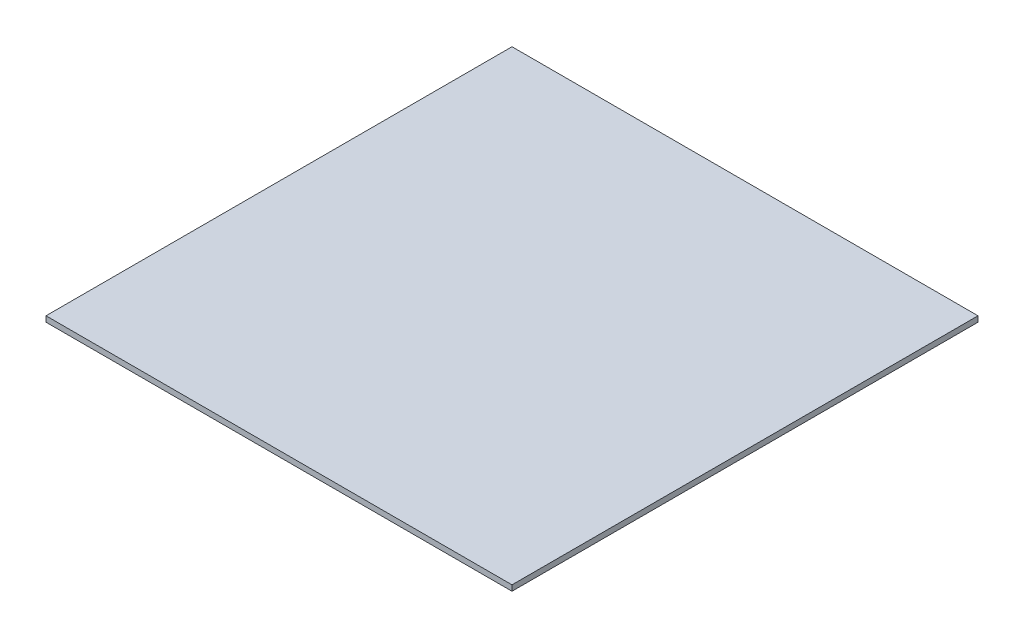
ISO-10303-21;
HEADER;
FILE_DESCRIPTION(('STEP AP214'),'2;1');
FILE_NAME('part.step','',(''),(''),'','','');
FILE_SCHEMA(('AUTOMOTIVE_DESIGN { 1 0 10303 214 1 1 1 1 }'));
ENDSEC;
DATA;
#1=APPLICATION_CONTEXT('core data for automotive mechanical design processes');
#2=APPLICATION_PROTOCOL_DEFINITION('international standard','automotive_design',2000,#1);
#3=PRODUCT_CONTEXT('',#1,'mechanical');
#4=PRODUCT('Part','Part','',(#3));
#5=PRODUCT_RELATED_PRODUCT_CATEGORY('part','',(#4));
#6=PRODUCT_DEFINITION_FORMATION('','',#4);
#7=PRODUCT_DEFINITION_CONTEXT('part definition',#1,'design');
#8=PRODUCT_DEFINITION('design','',#6,#7);
#9=PRODUCT_DEFINITION_SHAPE('','',#8);
#10=(LENGTH_UNIT() NAMED_UNIT(*) SI_UNIT(.MILLI.,.METRE.));
#11=(NAMED_UNIT(*) PLANE_ANGLE_UNIT() SI_UNIT($,.RADIAN.));
#12=(NAMED_UNIT(*) SI_UNIT($,.STERADIAN.) SOLID_ANGLE_UNIT());
#13=UNCERTAINTY_MEASURE_WITH_UNIT(LENGTH_MEASURE(1.E-05),#10,'distance_accuracy_value','');
#14=(GEOMETRIC_REPRESENTATION_CONTEXT(3) GLOBAL_UNCERTAINTY_ASSIGNED_CONTEXT((#13)) GLOBAL_UNIT_ASSIGNED_CONTEXT((#10,
#11,#12)) REPRESENTATION_CONTEXT('',''));
#15=CARTESIAN_POINT('',(0.,0.,0.));
#16=DIRECTION('',(0.,0.,1.));
#17=DIRECTION('',(1.,0.,0.));
#18=AXIS2_PLACEMENT_3D('',#15,#16,#17);
#19=CARTESIAN_POINT('',(125.,3.,-125.));
#20=DIRECTION('',(-1.,0.,0.));
#21=DIRECTION('',(0.,0.,1.));
#22=AXIS2_PLACEMENT_3D('',#19,#20,#21);
#23=PLANE('',#22);
#24=DIRECTION('',(0.,0.,-1.));
#25=VECTOR('',#24,1.);
#26=CARTESIAN_POINT('',(125.,0.,-125.));
#27=LINE('',#26,#25);
#28=CARTESIAN_POINT('',(125.,0.,125.));
#29=VERTEX_POINT('',#28);
#30=CARTESIAN_POINT('',(125.,0.,-125.));
#31=VERTEX_POINT('',#30);
#32=EDGE_CURVE('E101',#29,#31,#27,.T.);
#33=ORIENTED_EDGE('',*,*,#32,.T.);
#34=DIRECTION('',(0.,-1.,0.));
#35=VECTOR('',#34,1.);
#36=CARTESIAN_POINT('',(125.,3.,-125.));
#37=LINE('',#36,#35);
#38=CARTESIAN_POINT('',(125.,3.,-125.));
#39=VERTEX_POINT('',#38);
#40=EDGE_CURVE('E11',#39,#31,#37,.T.);
#41=ORIENTED_EDGE('',*,*,#40,.F.);
#42=DIRECTION('',(0.,0.,-1.));
#43=VECTOR('',#42,1.);
#44=CARTESIAN_POINT('',(125.,3.,-125.));
#45=LINE('',#44,#43);
#46=CARTESIAN_POINT('',(125.,3.,125.));
#47=VERTEX_POINT('',#46);
#48=EDGE_CURVE('E89',#47,#39,#45,.T.);
#49=ORIENTED_EDGE('',*,*,#48,.F.);
#50=DIRECTION('',(0.,-1.,0.));
#51=VECTOR('',#50,1.);
#52=CARTESIAN_POINT('',(125.,3.,125.));
#53=LINE('',#52,#51);
#54=EDGE_CURVE('E97',#47,#29,#53,.T.);
#55=ORIENTED_EDGE('',*,*,#54,.T.);
#56=EDGE_LOOP('',(#33,#41,#49,#55));
#57=FACE_BOUND('',#56,.T.);
#58=ADVANCED_FACE('F38',(#57),#23,.F.);
#59=CARTESIAN_POINT('',(-125.,3.,-125.));
#60=DIRECTION('',(0.,0.,1.));
#61=DIRECTION('',(1.,0.,0.));
#62=AXIS2_PLACEMENT_3D('',#59,#60,#61);
#63=PLANE('',#62);
#64=DIRECTION('',(-1.,0.,0.));
#65=VECTOR('',#64,1.);
#66=CARTESIAN_POINT('',(-125.,0.,-125.));
#67=LINE('',#66,#65);
#68=CARTESIAN_POINT('',(-125.,0.,-125.));
#69=VERTEX_POINT('',#68);
#70=EDGE_CURVE('E93',#31,#69,#67,.T.);
#71=ORIENTED_EDGE('',*,*,#70,.T.);
#72=DIRECTION('',(0.,-1.,0.));
#73=VECTOR('',#72,1.);
#74=CARTESIAN_POINT('',(-125.,3.,-125.));
#75=LINE('',#74,#73);
#76=CARTESIAN_POINT('',(-125.,3.,-125.));
#77=VERTEX_POINT('',#76);
#78=EDGE_CURVE('E46',#77,#69,#75,.T.);
#79=ORIENTED_EDGE('',*,*,#78,.F.);
#80=DIRECTION('',(-1.,0.,0.));
#81=VECTOR('',#80,1.);
#82=CARTESIAN_POINT('',(-125.,3.,-125.));
#83=LINE('',#82,#81);
#84=EDGE_CURVE('E84',#39,#77,#83,.T.);
#85=ORIENTED_EDGE('',*,*,#84,.F.);
#86=ORIENTED_EDGE('',*,*,#40,.T.);
#87=EDGE_LOOP('',(#71,#79,#85,#86));
#88=FACE_BOUND('',#87,.T.);
#89=ADVANCED_FACE('F92',(#88),#63,.F.);
#90=CARTESIAN_POINT('',(-125.,3.,-125.));
#91=DIRECTION('',(1.,0.,0.));
#92=DIRECTION('',(0.,0.,-1.));
#93=AXIS2_PLACEMENT_3D('',#90,#91,#92);
#94=PLANE('',#93);
#95=DIRECTION('',(0.,0.,1.));
#96=VECTOR('',#95,1.);
#97=CARTESIAN_POINT('',(-125.,0.,-125.));
#98=LINE('',#97,#96);
#99=CARTESIAN_POINT('',(-125.,0.,125.));
#100=VERTEX_POINT('',#99);
#101=EDGE_CURVE('E71',#69,#100,#98,.T.);
#102=ORIENTED_EDGE('',*,*,#101,.T.);
#103=DIRECTION('',(0.,-1.,0.));
#104=VECTOR('',#103,1.);
#105=CARTESIAN_POINT('',(-125.,3.,125.));
#106=LINE('',#105,#104);
#107=CARTESIAN_POINT('',(-125.,3.,125.));
#108=VERTEX_POINT('',#107);
#109=EDGE_CURVE('E94',#108,#100,#106,.T.);
#110=ORIENTED_EDGE('',*,*,#109,.F.);
#111=DIRECTION('',(0.,0.,1.));
#112=VECTOR('',#111,1.);
#113=CARTESIAN_POINT('',(-125.,3.,-125.));
#114=LINE('',#113,#112);
#115=EDGE_CURVE('E87',#77,#108,#114,.T.);
#116=ORIENTED_EDGE('',*,*,#115,.F.);
#117=ORIENTED_EDGE('',*,*,#78,.T.);
#118=EDGE_LOOP('',(#102,#110,#116,#117));
#119=FACE_BOUND('',#118,.T.);
#120=ADVANCED_FACE('F95',(#119),#94,.F.);
#121=CARTESIAN_POINT('',(-125.,3.,125.));
#122=DIRECTION('',(0.,0.,-1.));
#123=DIRECTION('',(-1.,0.,0.));
#124=AXIS2_PLACEMENT_3D('',#121,#122,#123);
#125=PLANE('',#124);
#126=DIRECTION('',(1.,0.,0.));
#127=VECTOR('',#126,1.);
#128=CARTESIAN_POINT('',(-125.,0.,125.));
#129=LINE('',#128,#127);
#130=EDGE_CURVE('E77',#100,#29,#129,.T.);
#131=ORIENTED_EDGE('',*,*,#130,.T.);
#132=ORIENTED_EDGE('',*,*,#54,.F.);
#133=DIRECTION('',(1.,0.,0.));
#134=VECTOR('',#133,1.);
#135=CARTESIAN_POINT('',(-125.,3.,125.));
#136=LINE('',#135,#134);
#137=EDGE_CURVE('E54',#108,#47,#136,.T.);
#138=ORIENTED_EDGE('',*,*,#137,.F.);
#139=ORIENTED_EDGE('',*,*,#109,.T.);
#140=EDGE_LOOP('',(#131,#132,#138,#139));
#141=FACE_BOUND('',#140,.T.);
#142=ADVANCED_FACE('F108',(#141),#125,.F.);
#143=CARTESIAN_POINT('',(0.,3.,0.));
#144=DIRECTION('',(0.,1.,0.));
#145=DIRECTION('',(0.,0.,1.));
#146=AXIS2_PLACEMENT_3D('',#143,#144,#145);
#147=PLANE('',#146);
#148=ORIENTED_EDGE('',*,*,#48,.T.);
#149=ORIENTED_EDGE('',*,*,#84,.T.);
#150=ORIENTED_EDGE('',*,*,#115,.T.);
#151=ORIENTED_EDGE('',*,*,#137,.T.);
#152=EDGE_LOOP('',(#148,#149,#150,#151));
#153=FACE_BOUND('',#152,.T.);
#154=ADVANCED_FACE('F85',(#153),#147,.T.);
#155=CARTESIAN_POINT('',(0.,0.,0.));
#156=DIRECTION('',(0.,1.,0.));
#157=DIRECTION('',(0.,0.,1.));
#158=AXIS2_PLACEMENT_3D('',#155,#156,#157);
#159=PLANE('',#158);
#160=ORIENTED_EDGE('',*,*,#32,.F.);
#161=ORIENTED_EDGE('',*,*,#130,.F.);
#162=ORIENTED_EDGE('',*,*,#101,.F.);
#163=ORIENTED_EDGE('',*,*,#70,.F.);
#164=EDGE_LOOP('',(#160,#161,#162,#163));
#165=FACE_BOUND('',#164,.T.);
#166=ADVANCED_FACE('F111',(#165),#159,.F.);
#167=CLOSED_SHELL('',(#58,#89,#120,#142,#154,#166));
#168=MANIFOLD_SOLID_BREP('B2',#167);
#169=ADVANCED_BREP_SHAPE_REPRESENTATION('',(#18,#168),#14);
#170=SHAPE_DEFINITION_REPRESENTATION(#9,#169);
ENDSEC;
END-ISO-10303-21;
